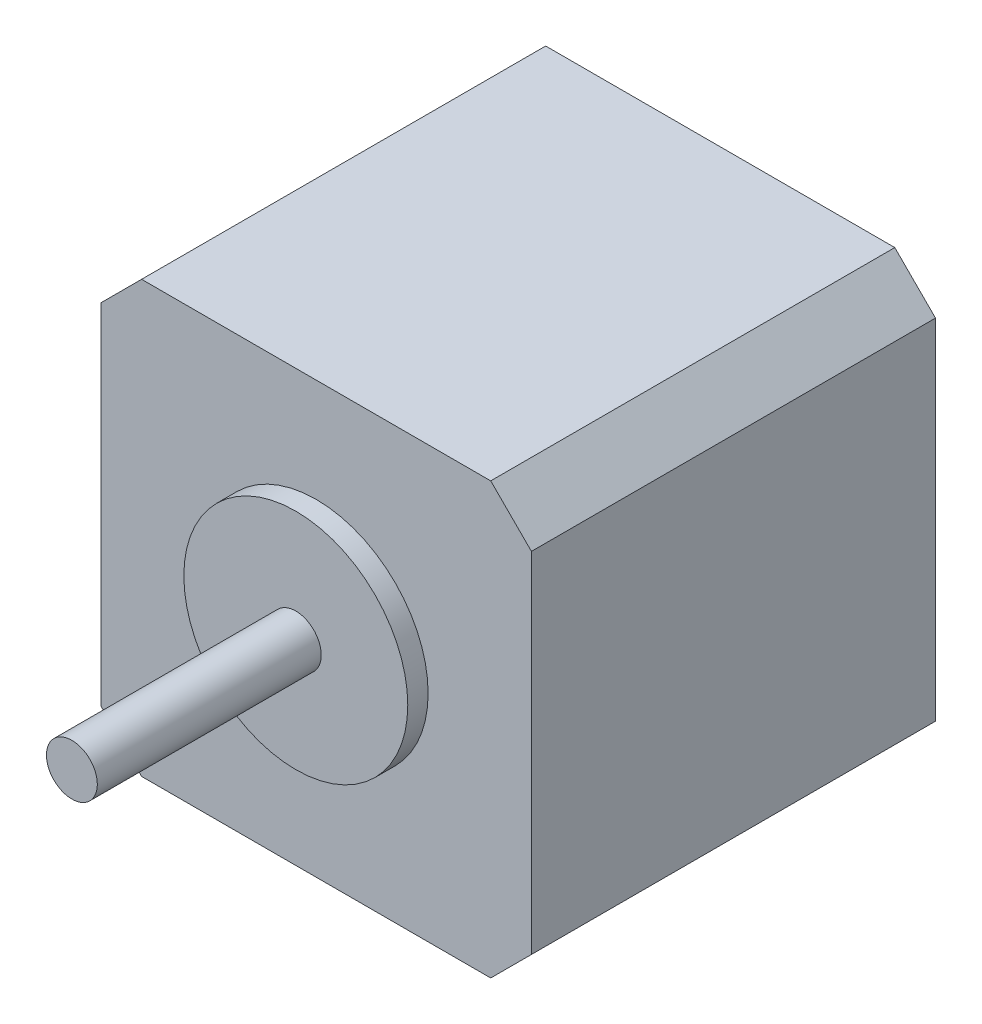
ISO-10303-21;
HEADER;
FILE_DESCRIPTION(('STEP AP214'),'2;1');
FILE_NAME('part.step','',(''),(''),'','','');
FILE_SCHEMA(('AUTOMOTIVE_DESIGN { 1 0 10303 214 1 1 1 1 }'));
ENDSEC;
DATA;
#1=APPLICATION_CONTEXT('core data for automotive mechanical design processes');
#2=APPLICATION_PROTOCOL_DEFINITION('international standard','automotive_design',2000,#1);
#3=PRODUCT_CONTEXT('',#1,'mechanical');
#4=PRODUCT('Part','Part','',(#3));
#5=PRODUCT_RELATED_PRODUCT_CATEGORY('part','',(#4));
#6=PRODUCT_DEFINITION_FORMATION('','',#4);
#7=PRODUCT_DEFINITION_CONTEXT('part definition',#1,'design');
#8=PRODUCT_DEFINITION('design','',#6,#7);
#9=PRODUCT_DEFINITION_SHAPE('','',#8);
#10=(LENGTH_UNIT() NAMED_UNIT(*) SI_UNIT(.MILLI.,.METRE.));
#11=(NAMED_UNIT(*) PLANE_ANGLE_UNIT() SI_UNIT($,.RADIAN.));
#12=(NAMED_UNIT(*) SI_UNIT($,.STERADIAN.) SOLID_ANGLE_UNIT());
#13=UNCERTAINTY_MEASURE_WITH_UNIT(LENGTH_MEASURE(1.E-05),#10,'distance_accuracy_value','');
#14=(GEOMETRIC_REPRESENTATION_CONTEXT(3) GLOBAL_UNCERTAINTY_ASSIGNED_CONTEXT((#13)) GLOBAL_UNIT_ASSIGNED_CONTEXT((#10,
#11,#12)) REPRESENTATION_CONTEXT('',''));
#15=CARTESIAN_POINT('',(0.,0.,0.));
#16=DIRECTION('',(0.,0.,1.));
#17=DIRECTION('',(1.,0.,0.));
#18=AXIS2_PLACEMENT_3D('',#15,#16,#17);
#19=CARTESIAN_POINT('',(0.,0.,24.));
#20=DIRECTION('',(0.,0.,1.));
#21=DIRECTION('',(1.,0.,0.));
#22=AXIS2_PLACEMENT_3D('',#19,#20,#21);
#23=PLANE('',#22);
#24=CARTESIAN_POINT('',(0.,0.,24.));
#25=DIRECTION('',(0.,0.,1.));
#26=DIRECTION('',(1.,0.,0.));
#27=AXIS2_PLACEMENT_3D('',#24,#25,#26);
#28=CIRCLE('',#27,2.5);
#29=CARTESIAN_POINT('',(2.5,0.,24.));
#30=VERTEX_POINT('',#29);
#31=EDGE_CURVE('E9',#30,#30,#28,.T.);
#32=ORIENTED_EDGE('',*,*,#31,.T.);
#33=EDGE_LOOP('',(#32));
#34=FACE_BOUND('',#33,.T.);
#35=ADVANCED_FACE('F15',(#34),#23,.T.);
#36=CARTESIAN_POINT('',(0.,0.,0.));
#37=DIRECTION('',(0.,0.,-1.));
#38=DIRECTION('',(1.,0.,0.));
#39=AXIS2_PLACEMENT_3D('',#36,#37,#38);
#40=CYLINDRICAL_SURFACE('',#39,2.5);
#41=DIRECTION('',(0.,0.,1.));
#42=VECTOR('',#41,1.);
#43=CARTESIAN_POINT('',(2.5,0.,0.));
#44=LINE('',#43,#42);
#45=CARTESIAN_POINT('',(2.5,0.,2.));
#46=VERTEX_POINT('',#45);
#47=EDGE_CURVE('E23',#46,#30,#44,.T.);
#48=ORIENTED_EDGE('',*,*,#47,.T.);
#49=ORIENTED_EDGE('',*,*,#31,.F.);
#50=ORIENTED_EDGE('',*,*,#47,.F.);
#51=CARTESIAN_POINT('',(0.,0.,2.));
#52=DIRECTION('',(0.,0.,-1.));
#53=DIRECTION('',(1.,0.,0.));
#54=AXIS2_PLACEMENT_3D('',#51,#52,#53);
#55=CIRCLE('',#54,2.5);
#56=EDGE_CURVE('E226',#46,#46,#55,.T.);
#57=ORIENTED_EDGE('',*,*,#56,.F.);
#58=EDGE_LOOP('',(#48,#49,#50,#57));
#59=FACE_BOUND('',#58,.T.);
#60=ADVANCED_FACE('F230',(#59),#40,.T.);
#61=CARTESIAN_POINT('',(0.,0.,2.));
#62=DIRECTION('',(0.,0.,1.));
#63=DIRECTION('',(1.,0.,0.));
#64=AXIS2_PLACEMENT_3D('',#61,#62,#63);
#65=PLANE('',#64);
#66=ORIENTED_EDGE('',*,*,#56,.T.);
#67=EDGE_LOOP('',(#66));
#68=FACE_BOUND('',#67,.T.);
#69=CARTESIAN_POINT('',(0.,0.,2.));
#70=DIRECTION('',(0.,0.,1.));
#71=DIRECTION('',(1.,0.,0.));
#72=AXIS2_PLACEMENT_3D('',#69,#70,#71);
#73=CIRCLE('',#72,11.);
#74=CARTESIAN_POINT('',(11.,0.,2.));
#75=VERTEX_POINT('',#74);
#76=EDGE_CURVE('E224',#75,#75,#73,.T.);
#77=ORIENTED_EDGE('',*,*,#76,.T.);
#78=EDGE_LOOP('',(#77));
#79=FACE_BOUND('',#78,.T.);
#80=ADVANCED_FACE('F235',(#68,#79),#65,.T.);
#81=CARTESIAN_POINT('',(0.,0.,0.));
#82=DIRECTION('',(0.,0.,-1.));
#83=DIRECTION('',(1.,0.,0.));
#84=AXIS2_PLACEMENT_3D('',#81,#82,#83);
#85=CYLINDRICAL_SURFACE('',#84,11.);
#86=CARTESIAN_POINT('',(0.,0.,0.));
#87=DIRECTION('',(0.,0.,1.));
#88=DIRECTION('',(1.,0.,0.));
#89=AXIS2_PLACEMENT_3D('',#86,#87,#88);
#90=CIRCLE('',#89,11.);
#91=CARTESIAN_POINT('',(11.,0.,0.));
#92=VERTEX_POINT('',#91);
#93=EDGE_CURVE('E170',#92,#92,#90,.T.);
#94=ORIENTED_EDGE('',*,*,#93,.T.);
#95=DIRECTION('',(0.,0.,1.));
#96=VECTOR('',#95,1.);
#97=CARTESIAN_POINT('',(11.,0.,0.));
#98=LINE('',#97,#96);
#99=EDGE_CURVE('E218',#92,#75,#98,.T.);
#100=ORIENTED_EDGE('',*,*,#99,.T.);
#101=ORIENTED_EDGE('',*,*,#76,.F.);
#102=ORIENTED_EDGE('',*,*,#99,.F.);
#103=EDGE_LOOP('',(#94,#100,#101,#102));
#104=FACE_BOUND('',#103,.T.);
#105=ADVANCED_FACE('F234',(#104),#85,.T.);
#106=CARTESIAN_POINT('',(21.15,-21.15,-39.7));
#107=DIRECTION('',(1.,0.,0.));
#108=DIRECTION('',(0.,1.,0.));
#109=AXIS2_PLACEMENT_3D('',#106,#107,#108);
#110=PLANE('',#109);
#111=DIRECTION('',(0.,1.,0.));
#112=VECTOR('',#111,1.);
#113=CARTESIAN_POINT('',(21.15,-21.15,0.));
#114=LINE('',#113,#112);
#115=CARTESIAN_POINT('',(21.15,-17.15,0.));
#116=VERTEX_POINT('',#115);
#117=CARTESIAN_POINT('',(21.15,17.15,0.));
#118=VERTEX_POINT('',#117);
#119=EDGE_CURVE('E171',#116,#118,#114,.T.);
#120=ORIENTED_EDGE('',*,*,#119,.F.);
#121=DIRECTION('',(0.,0.,1.));
#122=VECTOR('',#121,1.);
#123=CARTESIAN_POINT('',(21.15,-17.15,-39.7));
#124=LINE('',#123,#122);
#125=CARTESIAN_POINT('',(21.15,-17.15,-39.7));
#126=VERTEX_POINT('',#125);
#127=EDGE_CURVE('E213',#126,#116,#124,.T.);
#128=ORIENTED_EDGE('',*,*,#127,.F.);
#129=DIRECTION('',(0.,1.,0.));
#130=VECTOR('',#129,1.);
#131=CARTESIAN_POINT('',(21.15,-21.15,-39.7));
#132=LINE('',#131,#130);
#133=CARTESIAN_POINT('',(21.15,17.15,-39.7));
#134=VERTEX_POINT('',#133);
#135=EDGE_CURVE('E193',#126,#134,#132,.T.);
#136=ORIENTED_EDGE('',*,*,#135,.T.);
#137=DIRECTION('',(0.,0.,1.));
#138=VECTOR('',#137,1.);
#139=CARTESIAN_POINT('',(21.15,17.15,-39.7));
#140=LINE('',#139,#138);
#141=EDGE_CURVE('E216',#134,#118,#140,.T.);
#142=ORIENTED_EDGE('',*,*,#141,.T.);
#143=EDGE_LOOP('',(#120,#128,#136,#142));
#144=FACE_BOUND('',#143,.T.);
#145=ADVANCED_FACE('F256',(#144),#110,.T.);
#146=CARTESIAN_POINT('',(19.15,19.15,-39.7));
#147=DIRECTION('',(0.707106781186548,0.707106781186548,0.));
#148=DIRECTION('',(0.,0.,-1.));
#149=AXIS2_PLACEMENT_3D('',#146,#147,#148);
#150=PLANE('',#149);
#151=DIRECTION('',(0.,0.,1.));
#152=VECTOR('',#151,1.);
#153=CARTESIAN_POINT('',(17.15,21.15,-39.7));
#154=LINE('',#153,#152);
#155=CARTESIAN_POINT('',(17.15,21.15,-39.7));
#156=VERTEX_POINT('',#155);
#157=CARTESIAN_POINT('',(17.15,21.15,0.));
#158=VERTEX_POINT('',#157);
#159=EDGE_CURVE('E209',#156,#158,#154,.T.);
#160=ORIENTED_EDGE('',*,*,#159,.T.);
#161=DIRECTION('',(-0.707106781186548,0.707106781186548,0.));
#162=VECTOR('',#161,1.);
#163=CARTESIAN_POINT('',(19.15,19.15,0.));
#164=LINE('',#163,#162);
#165=EDGE_CURVE('E156',#118,#158,#164,.T.);
#166=ORIENTED_EDGE('',*,*,#165,.F.);
#167=ORIENTED_EDGE('',*,*,#141,.F.);
#168=DIRECTION('',(-0.707106781186548,0.707106781186548,0.));
#169=VECTOR('',#168,1.);
#170=CARTESIAN_POINT('',(19.15,19.15,-39.7));
#171=LINE('',#170,#169);
#172=EDGE_CURVE('E192',#134,#156,#171,.T.);
#173=ORIENTED_EDGE('',*,*,#172,.T.);
#174=EDGE_LOOP('',(#160,#166,#167,#173));
#175=FACE_BOUND('',#174,.T.);
#176=ADVANCED_FACE('F265',(#175),#150,.T.);
#177=CARTESIAN_POINT('',(19.15,-19.15,-39.7));
#178=DIRECTION('',(-0.707106781186548,0.707106781186548,0.));
#179=DIRECTION('',(0.,0.,1.));
#180=AXIS2_PLACEMENT_3D('',#177,#178,#179);
#181=PLANE('',#180);
#182=DIRECTION('',(-0.707106781186548,-0.707106781186548,0.));
#183=VECTOR('',#182,1.);
#184=CARTESIAN_POINT('',(8.575,-29.725,-39.7));
#185=LINE('',#184,#183);
#186=CARTESIAN_POINT('',(17.15,-21.15,-39.7));
#187=VERTEX_POINT('',#186);
#188=EDGE_CURVE('E200',#126,#187,#185,.T.);
#189=ORIENTED_EDGE('',*,*,#188,.F.);
#190=ORIENTED_EDGE('',*,*,#127,.T.);
#191=DIRECTION('',(-0.707106781186548,-0.707106781186548,0.));
#192=VECTOR('',#191,1.);
#193=CARTESIAN_POINT('',(8.575,-29.725,0.));
#194=LINE('',#193,#192);
#195=CARTESIAN_POINT('',(17.15,-21.15,0.));
#196=VERTEX_POINT('',#195);
#197=EDGE_CURVE('E161',#116,#196,#194,.T.);
#198=ORIENTED_EDGE('',*,*,#197,.T.);
#199=DIRECTION('',(0.,0.,1.));
#200=VECTOR('',#199,1.);
#201=CARTESIAN_POINT('',(17.15,-21.15,-39.7));
#202=LINE('',#201,#200);
#203=EDGE_CURVE('E210',#187,#196,#202,.T.);
#204=ORIENTED_EDGE('',*,*,#203,.F.);
#205=EDGE_LOOP('',(#189,#190,#198,#204));
#206=FACE_BOUND('',#205,.T.);
#207=ADVANCED_FACE('F254',(#206),#181,.F.);
#208=CARTESIAN_POINT('',(-21.15,21.15,-39.7));
#209=DIRECTION('',(0.,1.,0.));
#210=DIRECTION('',(1.,0.,0.));
#211=AXIS2_PLACEMENT_3D('',#208,#209,#210);
#212=PLANE('',#211);
#213=DIRECTION('',(1.,0.,0.));
#214=VECTOR('',#213,1.);
#215=CARTESIAN_POINT('',(-21.15,21.15,-39.7));
#216=LINE('',#215,#214);
#217=CARTESIAN_POINT('',(-17.15,21.15,-39.7));
#218=VERTEX_POINT('',#217);
#219=EDGE_CURVE('E187',#218,#156,#216,.T.);
#220=ORIENTED_EDGE('',*,*,#219,.F.);
#221=DIRECTION('',(0.,0.,1.));
#222=VECTOR('',#221,1.);
#223=CARTESIAN_POINT('',(-17.15,21.15,-39.7));
#224=LINE('',#223,#222);
#225=CARTESIAN_POINT('',(-17.15,21.15,0.));
#226=VERTEX_POINT('',#225);
#227=EDGE_CURVE('E125',#218,#226,#224,.T.);
#228=ORIENTED_EDGE('',*,*,#227,.T.);
#229=DIRECTION('',(1.,0.,0.));
#230=VECTOR('',#229,1.);
#231=CARTESIAN_POINT('',(-21.15,21.15,0.));
#232=LINE('',#231,#230);
#233=EDGE_CURVE('E151',#226,#158,#232,.T.);
#234=ORIENTED_EDGE('',*,*,#233,.T.);
#235=ORIENTED_EDGE('',*,*,#159,.F.);
#236=EDGE_LOOP('',(#220,#228,#234,#235));
#237=FACE_BOUND('',#236,.T.);
#238=ADVANCED_FACE('F262',(#237),#212,.T.);
#239=CARTESIAN_POINT('',(-21.15,-21.15,-39.7));
#240=DIRECTION('',(0.,1.,0.));
#241=DIRECTION('',(1.,0.,0.));
#242=AXIS2_PLACEMENT_3D('',#239,#240,#241);
#243=PLANE('',#242);
#244=ORIENTED_EDGE('',*,*,#203,.T.);
#245=DIRECTION('',(1.,0.,0.));
#246=VECTOR('',#245,1.);
#247=CARTESIAN_POINT('',(-21.15,-21.15,0.));
#248=LINE('',#247,#246);
#249=CARTESIAN_POINT('',(-17.15,-21.15,0.));
#250=VERTEX_POINT('',#249);
#251=EDGE_CURVE('E160',#250,#196,#248,.T.);
#252=ORIENTED_EDGE('',*,*,#251,.F.);
#253=DIRECTION('',(0.,0.,1.));
#254=VECTOR('',#253,1.);
#255=CARTESIAN_POINT('',(-17.15,-21.15,-39.7));
#256=LINE('',#255,#254);
#257=CARTESIAN_POINT('',(-17.15,-21.15,-39.7));
#258=VERTEX_POINT('',#257);
#259=EDGE_CURVE('E185',#258,#250,#256,.T.);
#260=ORIENTED_EDGE('',*,*,#259,.F.);
#261=DIRECTION('',(1.,0.,0.));
#262=VECTOR('',#261,1.);
#263=CARTESIAN_POINT('',(-21.15,-21.15,-39.7));
#264=LINE('',#263,#262);
#265=EDGE_CURVE('E201',#258,#187,#264,.T.);
#266=ORIENTED_EDGE('',*,*,#265,.T.);
#267=EDGE_LOOP('',(#244,#252,#260,#266));
#268=FACE_BOUND('',#267,.T.);
#269=ADVANCED_FACE('F248',(#268),#243,.F.);
#270=CARTESIAN_POINT('',(-21.15,-21.15,-39.7));
#271=DIRECTION('',(0.,0.,1.));
#272=DIRECTION('',(1.,0.,0.));
#273=AXIS2_PLACEMENT_3D('',#270,#271,#272);
#274=PLANE('',#273);
#275=DIRECTION('',(0.707106781186548,0.707106781186548,0.));
#276=VECTOR('',#275,1.);
#277=CARTESIAN_POINT('',(-29.725,8.575,-39.7));
#278=LINE('',#277,#276);
#279=CARTESIAN_POINT('',(-21.15,17.15,-39.7));
#280=VERTEX_POINT('',#279);
#281=EDGE_CURVE('E116',#280,#218,#278,.T.);
#282=ORIENTED_EDGE('',*,*,#281,.T.);
#283=ORIENTED_EDGE('',*,*,#219,.T.);
#284=ORIENTED_EDGE('',*,*,#172,.F.);
#285=ORIENTED_EDGE('',*,*,#135,.F.);
#286=ORIENTED_EDGE('',*,*,#188,.T.);
#287=ORIENTED_EDGE('',*,*,#265,.F.);
#288=DIRECTION('',(0.707106781186548,-0.707106781186548,0.));
#289=VECTOR('',#288,1.);
#290=CARTESIAN_POINT('',(-19.15,-19.15,-39.7));
#291=LINE('',#290,#289);
#292=CARTESIAN_POINT('',(-21.15,-17.15,-39.7));
#293=VERTEX_POINT('',#292);
#294=EDGE_CURVE('E130',#293,#258,#291,.T.);
#295=ORIENTED_EDGE('',*,*,#294,.F.);
#296=DIRECTION('',(0.,1.,0.));
#297=VECTOR('',#296,1.);
#298=CARTESIAN_POINT('',(-21.15,-21.15,-39.7));
#299=LINE('',#298,#297);
#300=EDGE_CURVE('E127',#293,#280,#299,.T.);
#301=ORIENTED_EDGE('',*,*,#300,.T.);
#302=EDGE_LOOP('',(#282,#283,#284,#285,#286,#287,#295,#301));
#303=FACE_BOUND('',#302,.T.);
#304=ADVANCED_FACE('F129',(#303),#274,.F.);
#305=CARTESIAN_POINT('',(-19.15,19.15,-39.7));
#306=DIRECTION('',(0.707106781186548,-0.707106781186548,0.));
#307=DIRECTION('',(0.,0.,-1.));
#308=AXIS2_PLACEMENT_3D('',#305,#306,#307);
#309=PLANE('',#308);
#310=ORIENTED_EDGE('',*,*,#281,.F.);
#311=DIRECTION('',(0.,0.,1.));
#312=VECTOR('',#311,1.);
#313=CARTESIAN_POINT('',(-21.15,17.15,-39.7));
#314=LINE('',#313,#312);
#315=CARTESIAN_POINT('',(-21.15,17.15,0.));
#316=VERTEX_POINT('',#315);
#317=EDGE_CURVE('E121',#280,#316,#314,.T.);
#318=ORIENTED_EDGE('',*,*,#317,.T.);
#319=DIRECTION('',(0.707106781186548,0.707106781186548,0.));
#320=VECTOR('',#319,1.);
#321=CARTESIAN_POINT('',(-29.725,8.575,0.));
#322=LINE('',#321,#320);
#323=EDGE_CURVE('E154',#316,#226,#322,.T.);
#324=ORIENTED_EDGE('',*,*,#323,.T.);
#325=ORIENTED_EDGE('',*,*,#227,.F.);
#326=EDGE_LOOP('',(#310,#318,#324,#325));
#327=FACE_BOUND('',#326,.T.);
#328=ADVANCED_FACE('F119',(#327),#309,.F.);
#329=CARTESIAN_POINT('',(-19.15,-19.15,-39.7));
#330=DIRECTION('',(-0.707106781186548,-0.707106781186548,0.));
#331=DIRECTION('',(-0.707106781186548,0.707106781186548,0.));
#332=AXIS2_PLACEMENT_3D('',#329,#330,#331);
#333=PLANE('',#332);
#334=ORIENTED_EDGE('',*,*,#259,.T.);
#335=DIRECTION('',(0.707106781186548,-0.707106781186548,0.));
#336=VECTOR('',#335,1.);
#337=CARTESIAN_POINT('',(-19.15,-19.15,0.));
#338=LINE('',#337,#336);
#339=CARTESIAN_POINT('',(-21.15,-17.15,0.));
#340=VERTEX_POINT('',#339);
#341=EDGE_CURVE('E147',#340,#250,#338,.T.);
#342=ORIENTED_EDGE('',*,*,#341,.F.);
#343=DIRECTION('',(0.,0.,1.));
#344=VECTOR('',#343,1.);
#345=CARTESIAN_POINT('',(-21.15,-17.15,-39.7));
#346=LINE('',#345,#344);
#347=EDGE_CURVE('E137',#293,#340,#346,.T.);
#348=ORIENTED_EDGE('',*,*,#347,.F.);
#349=ORIENTED_EDGE('',*,*,#294,.T.);
#350=EDGE_LOOP('',(#334,#342,#348,#349));
#351=FACE_BOUND('',#350,.T.);
#352=ADVANCED_FACE('F242',(#351),#333,.T.);
#353=CARTESIAN_POINT('',(-21.15,-21.15,0.));
#354=DIRECTION('',(0.,0.,1.));
#355=DIRECTION('',(1.,0.,0.));
#356=AXIS2_PLACEMENT_3D('',#353,#354,#355);
#357=PLANE('',#356);
#358=ORIENTED_EDGE('',*,*,#93,.F.);
#359=EDGE_LOOP('',(#358));
#360=FACE_BOUND('',#359,.T.);
#361=DIRECTION('',(0.,1.,0.));
#362=VECTOR('',#361,1.);
#363=CARTESIAN_POINT('',(-21.15,-21.15,0.));
#364=LINE('',#363,#362);
#365=EDGE_CURVE('E143',#340,#316,#364,.T.);
#366=ORIENTED_EDGE('',*,*,#365,.F.);
#367=ORIENTED_EDGE('',*,*,#341,.T.);
#368=ORIENTED_EDGE('',*,*,#251,.T.);
#369=ORIENTED_EDGE('',*,*,#197,.F.);
#370=ORIENTED_EDGE('',*,*,#119,.T.);
#371=ORIENTED_EDGE('',*,*,#165,.T.);
#372=ORIENTED_EDGE('',*,*,#233,.F.);
#373=ORIENTED_EDGE('',*,*,#323,.F.);
#374=EDGE_LOOP('',(#366,#367,#368,#369,#370,#371,#372,#373));
#375=FACE_BOUND('',#374,.T.);
#376=ADVANCED_FACE('F239',(#360,#375),#357,.T.);
#377=CARTESIAN_POINT('',(-21.15,-21.15,-39.7));
#378=DIRECTION('',(1.,0.,0.));
#379=DIRECTION('',(0.,1.,0.));
#380=AXIS2_PLACEMENT_3D('',#377,#378,#379);
#381=PLANE('',#380);
#382=ORIENTED_EDGE('',*,*,#317,.F.);
#383=ORIENTED_EDGE('',*,*,#300,.F.);
#384=ORIENTED_EDGE('',*,*,#347,.T.);
#385=ORIENTED_EDGE('',*,*,#365,.T.);
#386=EDGE_LOOP('',(#382,#383,#384,#385));
#387=FACE_BOUND('',#386,.T.);
#388=ADVANCED_FACE('F136',(#387),#381,.F.);
#389=CLOSED_SHELL('',(#35,#60,#80,#105,#145,#176,#207,#238,#269,#304,#328,#352,#376,#388));
#390=MANIFOLD_SOLID_BREP('B1',#389);
#391=ADVANCED_BREP_SHAPE_REPRESENTATION('',(#18,#390),#14);
#392=SHAPE_DEFINITION_REPRESENTATION(#9,#391);
ENDSEC;
END-ISO-10303-21;
